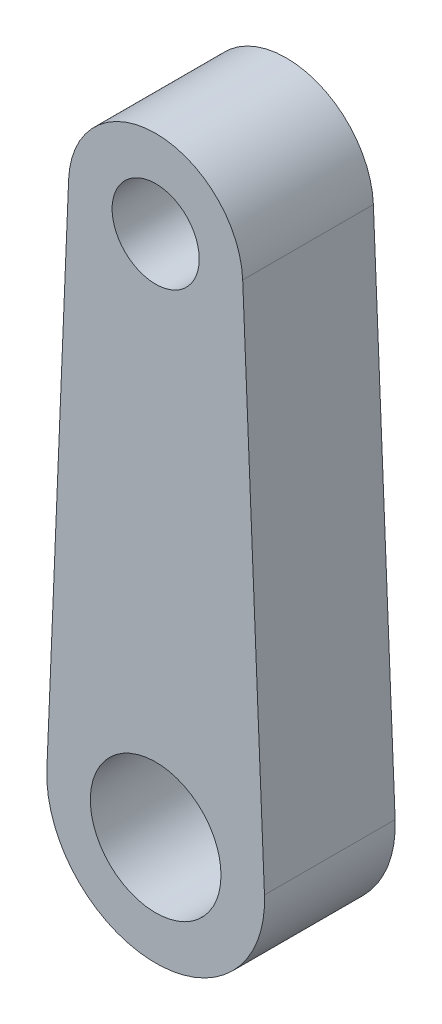
ISO-10303-21;
HEADER;
FILE_DESCRIPTION(('STEP AP214'),'2;1');
FILE_NAME('part.step','',(''),(''),'','','');
FILE_SCHEMA(('AUTOMOTIVE_DESIGN { 1 0 10303 214 1 1 1 1 }'));
ENDSEC;
DATA;
#1=APPLICATION_CONTEXT('core data for automotive mechanical design processes');
#2=APPLICATION_PROTOCOL_DEFINITION('international standard','automotive_design',2000,#1);
#3=PRODUCT_CONTEXT('',#1,'mechanical');
#4=PRODUCT('Part','Part','',(#3));
#5=PRODUCT_RELATED_PRODUCT_CATEGORY('part','',(#4));
#6=PRODUCT_DEFINITION_FORMATION('','',#4);
#7=PRODUCT_DEFINITION_CONTEXT('part definition',#1,'design');
#8=PRODUCT_DEFINITION('design','',#6,#7);
#9=PRODUCT_DEFINITION_SHAPE('','',#8);
#10=(LENGTH_UNIT() NAMED_UNIT(*) SI_UNIT(.MILLI.,.METRE.));
#11=(NAMED_UNIT(*) PLANE_ANGLE_UNIT() SI_UNIT($,.RADIAN.));
#12=(NAMED_UNIT(*) SI_UNIT($,.STERADIAN.) SOLID_ANGLE_UNIT());
#13=UNCERTAINTY_MEASURE_WITH_UNIT(LENGTH_MEASURE(1.E-05),#10,'distance_accuracy_value','');
#14=(GEOMETRIC_REPRESENTATION_CONTEXT(3) GLOBAL_UNCERTAINTY_ASSIGNED_CONTEXT((#13)) GLOBAL_UNIT_ASSIGNED_CONTEXT((#10,
#11,#12)) REPRESENTATION_CONTEXT('',''));
#15=CARTESIAN_POINT('',(0.,0.,0.));
#16=DIRECTION('',(0.,0.,1.));
#17=DIRECTION('',(1.,0.,0.));
#18=AXIS2_PLACEMENT_3D('',#15,#16,#17);
#19=CARTESIAN_POINT('',(0.,6.,3.));
#20=DIRECTION('',(0.,0.,1.));
#21=DIRECTION('',(1.,0.,0.));
#22=AXIS2_PLACEMENT_3D('',#19,#20,#21);
#23=PLANE('',#22);
#24=CARTESIAN_POINT('',(0.,6.,3.));
#25=DIRECTION('',(0.,0.,1.));
#26=DIRECTION('',(1.,0.,0.));
#27=AXIS2_PLACEMENT_3D('',#24,#25,#26);
#28=CIRCLE('',#27,1.);
#29=CARTESIAN_POINT('',(0.999999999999998,6.,3.));
#30=VERTEX_POINT('',#29);
#31=EDGE_CURVE('E112',#30,#30,#28,.T.);
#32=ORIENTED_EDGE('',*,*,#31,.F.);
#33=EDGE_LOOP('',(#32));
#34=FACE_BOUND('',#33,.T.);
#35=CARTESIAN_POINT('',(0.,6.,3.));
#36=DIRECTION('',(0.,0.,1.));
#37=DIRECTION('',(1.,0.,0.));
#38=AXIS2_PLACEMENT_3D('',#35,#36,#37);
#39=CIRCLE('',#38,2.);
#40=CARTESIAN_POINT('',(1.99826313471363,6.08333333333333,3.));
#41=VERTEX_POINT('',#40);
#42=CARTESIAN_POINT('',(-1.99826313471364,6.08333333333333,3.));
#43=VERTEX_POINT('',#42);
#44=EDGE_CURVE('E92',#41,#43,#39,.T.);
#45=ORIENTED_EDGE('',*,*,#44,.T.);
#46=DIRECTION('',(-0.0416666666666665,-0.999131567356817,0.));
#47=VECTOR('',#46,1.);
#48=CARTESIAN_POINT('',(-2.49782891839204,-5.89583333333333,3.));
#49=LINE('',#48,#47);
#50=CARTESIAN_POINT('',(-2.49782891839204,-5.89583333333333,3.));
#51=VERTEX_POINT('',#50);
#52=EDGE_CURVE('E87',#43,#51,#49,.T.);
#53=ORIENTED_EDGE('',*,*,#52,.T.);
#54=CARTESIAN_POINT('',(0.,-6.,3.));
#55=DIRECTION('',(0.,0.,1.));
#56=DIRECTION('',(1.,0.,0.));
#57=AXIS2_PLACEMENT_3D('',#54,#55,#56);
#58=CIRCLE('',#57,2.5);
#59=CARTESIAN_POINT('',(2.49782891839204,-5.89583333333333,3.));
#60=VERTEX_POINT('',#59);
#61=EDGE_CURVE('E90',#51,#60,#58,.T.);
#62=ORIENTED_EDGE('',*,*,#61,.T.);
#63=DIRECTION('',(-0.0416666666666668,0.999131567356817,0.));
#64=VECTOR('',#63,1.);
#65=CARTESIAN_POINT('',(1.99826313471363,6.08333333333333,3.));
#66=LINE('',#65,#64);
#67=EDGE_CURVE('E57',#60,#41,#66,.T.);
#68=ORIENTED_EDGE('',*,*,#67,.T.);
#69=EDGE_LOOP('',(#45,#53,#62,#68));
#70=FACE_BOUND('',#69,.T.);
#71=CARTESIAN_POINT('',(0.,-6.,3.));
#72=DIRECTION('',(0.,0.,1.));
#73=DIRECTION('',(1.,0.,0.));
#74=AXIS2_PLACEMENT_3D('',#71,#72,#73);
#75=CIRCLE('',#74,1.5);
#76=CARTESIAN_POINT('',(1.5,-6.,3.));
#77=VERTEX_POINT('',#76);
#78=EDGE_CURVE('E134',#77,#77,#75,.T.);
#79=ORIENTED_EDGE('',*,*,#78,.F.);
#80=EDGE_LOOP('',(#79));
#81=FACE_BOUND('',#80,.T.);
#82=ADVANCED_FACE('F39',(#34,#70,#81),#23,.T.);
#83=CARTESIAN_POINT('',(0.,6.,0.));
#84=DIRECTION('',(0.,0.,1.));
#85=DIRECTION('',(1.,0.,0.));
#86=AXIS2_PLACEMENT_3D('',#83,#84,#85);
#87=PLANE('',#86);
#88=CARTESIAN_POINT('',(0.,6.,0.));
#89=DIRECTION('',(0.,0.,1.));
#90=DIRECTION('',(1.,0.,0.));
#91=AXIS2_PLACEMENT_3D('',#88,#89,#90);
#92=CIRCLE('',#91,2.);
#93=CARTESIAN_POINT('',(1.99826313471363,6.08333333333333,0.));
#94=VERTEX_POINT('',#93);
#95=CARTESIAN_POINT('',(-1.99826313471364,6.08333333333333,0.));
#96=VERTEX_POINT('',#95);
#97=EDGE_CURVE('E108',#94,#96,#92,.T.);
#98=ORIENTED_EDGE('',*,*,#97,.F.);
#99=DIRECTION('',(-0.0416666666666668,0.999131567356817,0.));
#100=VECTOR('',#99,1.);
#101=CARTESIAN_POINT('',(1.99826313471363,6.08333333333333,0.));
#102=LINE('',#101,#100);
#103=CARTESIAN_POINT('',(2.49782891839204,-5.89583333333333,0.));
#104=VERTEX_POINT('',#103);
#105=EDGE_CURVE('E80',#104,#94,#102,.T.);
#106=ORIENTED_EDGE('',*,*,#105,.F.);
#107=CARTESIAN_POINT('',(0.,-6.,0.));
#108=DIRECTION('',(0.,0.,1.));
#109=DIRECTION('',(1.,0.,0.));
#110=AXIS2_PLACEMENT_3D('',#107,#108,#109);
#111=CIRCLE('',#110,2.5);
#112=CARTESIAN_POINT('',(-2.49782891839204,-5.89583333333333,0.));
#113=VERTEX_POINT('',#112);
#114=EDGE_CURVE('E74',#113,#104,#111,.T.);
#115=ORIENTED_EDGE('',*,*,#114,.F.);
#116=DIRECTION('',(-0.0416666666666665,-0.999131567356817,0.));
#117=VECTOR('',#116,1.);
#118=CARTESIAN_POINT('',(-2.49782891839204,-5.89583333333333,0.));
#119=LINE('',#118,#117);
#120=EDGE_CURVE('E97',#96,#113,#119,.T.);
#121=ORIENTED_EDGE('',*,*,#120,.F.);
#122=EDGE_LOOP('',(#98,#106,#115,#121));
#123=FACE_BOUND('',#122,.T.);
#124=CARTESIAN_POINT('',(0.,6.,0.));
#125=DIRECTION('',(0.,0.,1.));
#126=DIRECTION('',(1.,0.,0.));
#127=AXIS2_PLACEMENT_3D('',#124,#125,#126);
#128=CIRCLE('',#127,1.);
#129=CARTESIAN_POINT('',(0.999999999999998,6.,0.));
#130=VERTEX_POINT('',#129);
#131=EDGE_CURVE('E130',#130,#130,#128,.T.);
#132=ORIENTED_EDGE('',*,*,#131,.T.);
#133=EDGE_LOOP('',(#132));
#134=FACE_BOUND('',#133,.T.);
#135=CARTESIAN_POINT('',(0.,-6.,0.));
#136=DIRECTION('',(0.,0.,1.));
#137=DIRECTION('',(1.,0.,0.));
#138=AXIS2_PLACEMENT_3D('',#135,#136,#137);
#139=CIRCLE('',#138,1.5);
#140=CARTESIAN_POINT('',(1.5,-6.,0.));
#141=VERTEX_POINT('',#140);
#142=EDGE_CURVE('E138',#141,#141,#139,.T.);
#143=ORIENTED_EDGE('',*,*,#142,.T.);
#144=EDGE_LOOP('',(#143));
#145=FACE_BOUND('',#144,.T.);
#146=ADVANCED_FACE('F125',(#123,#134,#145),#87,.F.);
#147=CARTESIAN_POINT('',(0.,6.,3.));
#148=DIRECTION('',(0.,0.,-1.));
#149=DIRECTION('',(-1.,0.,0.));
#150=AXIS2_PLACEMENT_3D('',#147,#148,#149);
#151=CYLINDRICAL_SURFACE('',#150,2.);
#152=ORIENTED_EDGE('',*,*,#97,.T.);
#153=DIRECTION('',(0.,0.,-1.));
#154=VECTOR('',#153,1.);
#155=CARTESIAN_POINT('',(-1.99826313471364,6.08333333333333,3.));
#156=LINE('',#155,#154);
#157=EDGE_CURVE('E11',#43,#96,#156,.T.);
#158=ORIENTED_EDGE('',*,*,#157,.F.);
#159=ORIENTED_EDGE('',*,*,#44,.F.);
#160=DIRECTION('',(0.,0.,-1.));
#161=VECTOR('',#160,1.);
#162=CARTESIAN_POINT('',(1.99826313471363,6.08333333333333,3.));
#163=LINE('',#162,#161);
#164=EDGE_CURVE('E104',#41,#94,#163,.T.);
#165=ORIENTED_EDGE('',*,*,#164,.T.);
#166=EDGE_LOOP('',(#152,#158,#159,#165));
#167=FACE_BOUND('',#166,.T.);
#168=ADVANCED_FACE('F41',(#167),#151,.T.);
#169=CARTESIAN_POINT('',(-2.49782891839204,-5.89583333333333,3.));
#170=DIRECTION('',(0.999131567356817,-0.0416666666666665,0.));
#171=DIRECTION('',(0.0416666666666665,0.999131567356817,0.));
#172=AXIS2_PLACEMENT_3D('',#169,#170,#171);
#173=PLANE('',#172);
#174=ORIENTED_EDGE('',*,*,#120,.T.);
#175=DIRECTION('',(0.,0.,-1.));
#176=VECTOR('',#175,1.);
#177=CARTESIAN_POINT('',(-2.49782891839204,-5.89583333333333,3.));
#178=LINE('',#177,#176);
#179=EDGE_CURVE('E49',#51,#113,#178,.T.);
#180=ORIENTED_EDGE('',*,*,#179,.F.);
#181=ORIENTED_EDGE('',*,*,#52,.F.);
#182=ORIENTED_EDGE('',*,*,#157,.T.);
#183=EDGE_LOOP('',(#174,#180,#181,#182));
#184=FACE_BOUND('',#183,.T.);
#185=ADVANCED_FACE('F96',(#184),#173,.F.);
#186=CARTESIAN_POINT('',(0.,-6.,3.));
#187=DIRECTION('',(0.,0.,-1.));
#188=DIRECTION('',(-1.,0.,0.));
#189=AXIS2_PLACEMENT_3D('',#186,#187,#188);
#190=CYLINDRICAL_SURFACE('',#189,2.5);
#191=ORIENTED_EDGE('',*,*,#114,.T.);
#192=DIRECTION('',(0.,0.,-1.));
#193=VECTOR('',#192,1.);
#194=CARTESIAN_POINT('',(2.49782891839204,-5.89583333333333,3.));
#195=LINE('',#194,#193);
#196=EDGE_CURVE('E99',#60,#104,#195,.T.);
#197=ORIENTED_EDGE('',*,*,#196,.F.);
#198=ORIENTED_EDGE('',*,*,#61,.F.);
#199=ORIENTED_EDGE('',*,*,#179,.T.);
#200=EDGE_LOOP('',(#191,#197,#198,#199));
#201=FACE_BOUND('',#200,.T.);
#202=ADVANCED_FACE('F100',(#201),#190,.T.);
#203=CARTESIAN_POINT('',(1.99826313471363,6.08333333333333,3.));
#204=DIRECTION('',(-0.999131567356816,-0.0416666666666668,0.));
#205=DIRECTION('',(0.0416666666666668,-0.999131567356817,0.));
#206=AXIS2_PLACEMENT_3D('',#203,#204,#205);
#207=PLANE('',#206);
#208=ORIENTED_EDGE('',*,*,#105,.T.);
#209=ORIENTED_EDGE('',*,*,#164,.F.);
#210=ORIENTED_EDGE('',*,*,#67,.F.);
#211=ORIENTED_EDGE('',*,*,#196,.T.);
#212=EDGE_LOOP('',(#208,#209,#210,#211));
#213=FACE_BOUND('',#212,.T.);
#214=ADVANCED_FACE('F122',(#213),#207,.F.);
#215=CARTESIAN_POINT('',(0.,6.,3.));
#216=DIRECTION('',(0.,0.,-1.));
#217=DIRECTION('',(-1.,0.,0.));
#218=AXIS2_PLACEMENT_3D('',#215,#216,#217);
#219=CYLINDRICAL_SURFACE('',#218,1.);
#220=ORIENTED_EDGE('',*,*,#31,.T.);
#221=EDGE_LOOP('',(#220));
#222=FACE_BOUND('',#221,.T.);
#223=ORIENTED_EDGE('',*,*,#131,.F.);
#224=EDGE_LOOP('',(#223));
#225=FACE_BOUND('',#224,.T.);
#226=ADVANCED_FACE('F157',(#222,#225),#219,.F.);
#227=CARTESIAN_POINT('',(0.,-6.,3.));
#228=DIRECTION('',(0.,0.,-1.));
#229=DIRECTION('',(-1.,0.,0.));
#230=AXIS2_PLACEMENT_3D('',#227,#228,#229);
#231=CYLINDRICAL_SURFACE('',#230,1.5);
#232=ORIENTED_EDGE('',*,*,#78,.T.);
#233=EDGE_LOOP('',(#232));
#234=FACE_BOUND('',#233,.T.);
#235=ORIENTED_EDGE('',*,*,#142,.F.);
#236=EDGE_LOOP('',(#235));
#237=FACE_BOUND('',#236,.T.);
#238=ADVANCED_FACE('F146',(#234,#237),#231,.F.);
#239=CLOSED_SHELL('',(#82,#146,#168,#185,#202,#214,#226,#238));
#240=MANIFOLD_SOLID_BREP('B2',#239);
#241=ADVANCED_BREP_SHAPE_REPRESENTATION('',(#18,#240),#14);
#242=SHAPE_DEFINITION_REPRESENTATION(#9,#241);
ENDSEC;
END-ISO-10303-21;
